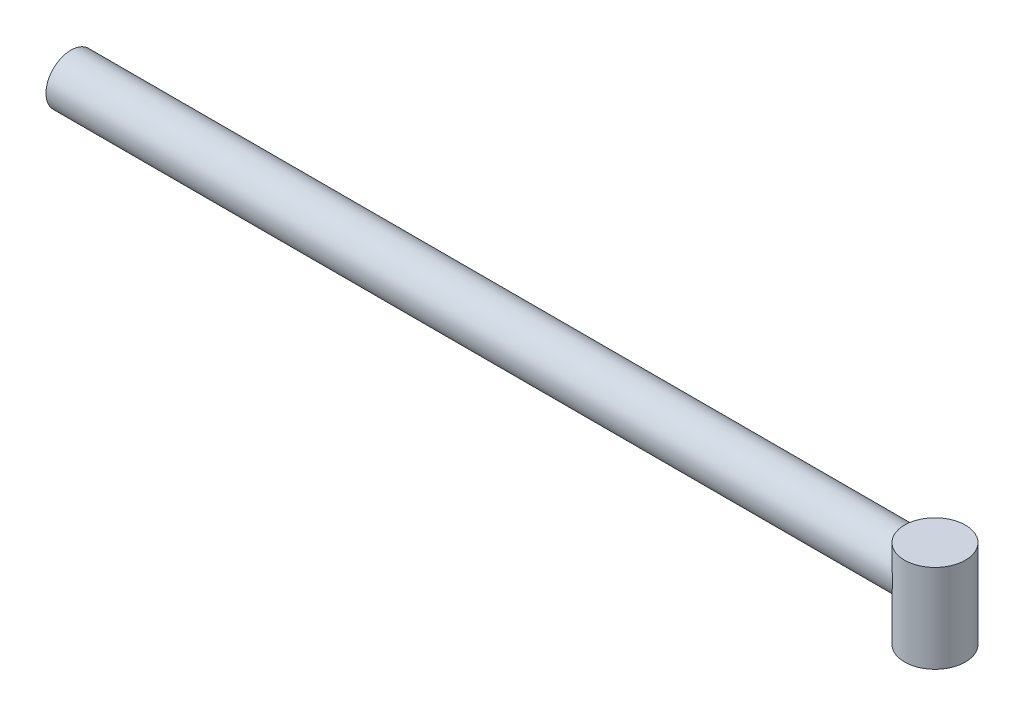
ISO-10303-21;
HEADER;
FILE_DESCRIPTION(('STEP AP214'),'2;1');
FILE_NAME('part.step','',(''),(''),'','','');
FILE_SCHEMA(('AUTOMOTIVE_DESIGN { 1 0 10303 214 1 1 1 1 }'));
ENDSEC;
DATA;
#1=APPLICATION_CONTEXT('core data for automotive mechanical design processes');
#2=APPLICATION_PROTOCOL_DEFINITION('international standard','automotive_design',2000,#1);
#3=PRODUCT_CONTEXT('',#1,'mechanical');
#4=PRODUCT('Part','Part','',(#3));
#5=PRODUCT_RELATED_PRODUCT_CATEGORY('part','',(#4));
#6=PRODUCT_DEFINITION_FORMATION('','',#4);
#7=PRODUCT_DEFINITION_CONTEXT('part definition',#1,'design');
#8=PRODUCT_DEFINITION('design','',#6,#7);
#9=PRODUCT_DEFINITION_SHAPE('','',#8);
#10=(LENGTH_UNIT() NAMED_UNIT(*) SI_UNIT(.MILLI.,.METRE.));
#11=(NAMED_UNIT(*) PLANE_ANGLE_UNIT() SI_UNIT($,.RADIAN.));
#12=(NAMED_UNIT(*) SI_UNIT($,.STERADIAN.) SOLID_ANGLE_UNIT());
#13=UNCERTAINTY_MEASURE_WITH_UNIT(LENGTH_MEASURE(1.E-05),#10,'distance_accuracy_value','');
#14=(GEOMETRIC_REPRESENTATION_CONTEXT(3) GLOBAL_UNCERTAINTY_ASSIGNED_CONTEXT((#13)) GLOBAL_UNIT_ASSIGNED_CONTEXT((#10,
#11,#12)) REPRESENTATION_CONTEXT('',''));
#15=CARTESIAN_POINT('',(0.,0.,0.));
#16=DIRECTION('',(0.,0.,1.));
#17=DIRECTION('',(1.,0.,0.));
#18=AXIS2_PLACEMENT_3D('',#15,#16,#17);
#19=CARTESIAN_POINT('',(-6.39999999999964,51.,-65.));
#20=DIRECTION('',(0.,-1.,0.));
#21=DIRECTION('',(0.,0.,-1.));
#22=AXIS2_PLACEMENT_3D('',#19,#20,#21);
#23=CYLINDRICAL_SURFACE('',#22,5.);
#24=CARTESIAN_POINT('',(-9.26181760425045,46.,-69.1));
#25=CARTESIAN_POINT('',(-9.26182009058065,46.0743333675964,-69.0999989941029));
#26=CARTESIAN_POINT('',(-9.26473134214739,46.148691400117,-69.0979716136917));
#27=CARTESIAN_POINT('',(-9.27621236259499,46.2967686263314,-69.0899197745307));
#28=CARTESIAN_POINT('',(-9.28478581734544,46.3704873721846,-69.0838927121342));
#29=CARTESIAN_POINT('',(-9.31845889761688,46.5901428345058,-69.0599750294437));
#30=CARTESIAN_POINT('',(-9.35150863151791,46.7342780920454,-69.0362487680238));
#31=CARTESIAN_POINT('',(-9.44859245880405,47.0667940029038,-68.963693511387));
#32=CARTESIAN_POINT('',(-9.51957723076212,47.2517070810486,-68.9088119030582));
#33=CARTESIAN_POINT('',(-9.67790203077611,47.6062190125497,-68.777036079782));
#34=CARTESIAN_POINT('',(-9.76529210878694,47.7757685829124,-68.7000741111909));
#35=CARTESIAN_POINT('',(-9.92027668207235,48.0521180884671,-68.55184086964));
#36=CARTESIAN_POINT('',(-9.98610586019386,48.1626742408293,-68.4855883223991));
#37=CARTESIAN_POINT('',(-10.1190471211521,48.376627477181,-68.3433749903128));
#38=CARTESIAN_POINT('',(-10.186159707292,48.4800216758837,-68.2674103274834));
#39=CARTESIAN_POINT('',(-10.3196580517801,48.6793995487549,-68.1060010562011));
#40=CARTESIAN_POINT('',(-10.3860445367348,48.7753913525074,-68.0205671061354));
#41=CARTESIAN_POINT('',(-10.5165124481894,48.9597136762682,-67.8401982287786));
#42=CARTESIAN_POINT('',(-10.5805935986791,49.0480432806814,-67.7452621689434));
#43=CARTESIAN_POINT('',(-10.7413661834399,49.2658249973713,-67.4874158241952));
#44=CARTESIAN_POINT('',(-10.8351631376861,49.3890444882589,-67.3172721814355));
#45=CARTESIAN_POINT('',(-11.0066242670531,49.6105211815253,-66.9542709655562));
#46=CARTESIAN_POINT('',(-11.0843141180581,49.7088181688186,-66.7614503224341));
#47=CARTESIAN_POINT('',(-11.2061326428141,49.8614299133952,-66.3901696160911));
#48=CARTESIAN_POINT('',(-11.2537094028949,49.9203630648498,-66.2147563153638));
#49=CARTESIAN_POINT('',(-11.3300267483656,50.0144647890552,-65.8536989069454));
#50=CARTESIAN_POINT('',(-11.3587779323515,50.0496467338257,-65.6680606197462));
#51=CARTESIAN_POINT('',(-11.395138477444,50.0940902410225,-65.2908702750752));
#52=CARTESIAN_POINT('',(-11.4026656304569,50.1032510153657,-65.0992981202672));
#53=CARTESIAN_POINT('',(-11.395649988203,50.0946947767343,-64.7171677137377));
#54=CARTESIAN_POINT('',(-11.3811073702065,50.0769779796476,-64.5266094538848));
#55=CARTESIAN_POINT('',(-11.3328252513853,50.0178390193171,-64.1641661834551));
#56=CARTESIAN_POINT('',(-11.3003305045733,49.9779530214034,-63.9918556184839));
#57=CARTESIAN_POINT('',(-11.2194064105117,49.8778273788801,-63.6572478892048));
#58=CARTESIAN_POINT('',(-11.1709728725957,49.8175823813199,-63.4949533716817));
#59=CARTESIAN_POINT('',(-11.0561087990059,49.6730707567149,-63.1688276939551));
#60=CARTESIAN_POINT('',(-10.988447623669,49.5871255914144,-63.0061824674516));
#61=CARTESIAN_POINT('',(-10.8416036833038,49.3972732093479,-62.6975198901236));
#62=CARTESIAN_POINT('',(-10.762415713212,49.2933578739271,-62.5515101046173));
#63=CARTESIAN_POINT('',(-10.579164166907,49.0468978648977,-62.2482477434636));
#64=CARTESIAN_POINT('',(-10.4733479577256,48.9008115373582,-62.0949459449713));
#65=CARTESIAN_POINT('',(-10.2571889999979,48.5885797630971,-61.8135367218202));
#66=CARTESIAN_POINT('',(-10.1468397128752,48.4224046176698,-61.6854673535323));
#67=CARTESIAN_POINT('',(-9.9859142468366,48.1617544499398,-61.514730368851));
#68=CARTESIAN_POINT('',(-9.93388940712684,48.0745514583477,-61.4621060134616));
#69=CARTESIAN_POINT('',(-9.83184388980893,47.8955165975834,-61.3630379158359));
#70=CARTESIAN_POINT('',(-9.78182359595807,47.8036838496012,-61.3165953531503));
#71=CARTESIAN_POINT('',(-9.68528598708616,47.6154315657492,-61.2302409013271));
#72=CARTESIAN_POINT('',(-9.6387628974303,47.5190200401088,-61.1903181128449));
#73=CARTESIAN_POINT('',(-9.55091487692975,47.3213993049725,-61.1173468745875));
#74=CARTESIAN_POINT('',(-9.50958695084022,47.2201929067133,-61.0842944564841));
#75=CARTESIAN_POINT('',(-9.42333214516696,46.9828663674868,-61.0171301102789));
#76=CARTESIAN_POINT('',(-9.38082535820453,46.845118834892,-60.9854800611594));
#77=CARTESIAN_POINT('',(-9.31349799464836,46.5630886941962,-60.9363424237359));
#78=CARTESIAN_POINT('',(-9.28863312317822,46.418823427401,-60.9188193505785));
#79=CARTESIAN_POINT('',(-9.26085471811797,46.125795720678,-60.8992865905289));
#80=CARTESIAN_POINT('',(-9.25812359035634,45.9770060346221,-60.8974058096129));
#81=CARTESIAN_POINT('',(-9.27569501176737,45.6814153106385,-60.9097116597854));
#82=CARTESIAN_POINT('',(-9.29602345014249,45.5346166955152,-60.9239163501604));
#83=CARTESIAN_POINT('',(-9.36174048556425,45.2186969036097,-60.9713544760774));
#84=CARTESIAN_POINT('',(-9.41132589739005,45.0509786912207,-61.0078238336239));
#85=CARTESIAN_POINT('',(-9.52848725230185,44.727016163466,-61.0989705982693));
#86=CARTESIAN_POINT('',(-9.5961200433921,44.5708101301447,-61.1537056800922));
#87=CARTESIAN_POINT('',(-9.72467501698522,44.304813789828,-61.264757743731));
#88=CARTESIAN_POINT('',(-9.78355716252405,44.1926171146152,-61.3178091500699));
#89=CARTESIAN_POINT('',(-9.90473029030125,43.9748244670871,-61.4329497873198));
#90=CARTESIAN_POINT('',(-9.96702296119446,43.8692318210825,-61.495043521083));
#91=CARTESIAN_POINT('',(-10.0930118361086,43.6644380029358,-61.6280462153747));
#92=CARTESIAN_POINT('',(-10.1567096145226,43.5652445459816,-61.6989655256377));
#93=CARTESIAN_POINT('',(-10.28376872603,43.3734404793592,-61.8494384912767));
#94=CARTESIAN_POINT('',(-10.3471301181265,43.280828677408,-61.9289905761723));
#95=CARTESIAN_POINT('',(-10.4737979175901,43.099981930436,-62.0990146367421));
#96=CARTESIAN_POINT('',(-10.5370548692623,43.0119374577158,-62.1897267972458));
#97=CARTESIAN_POINT('',(-10.6602349009175,42.8435954797962,-62.3802156967417));
#98=CARTESIAN_POINT('',(-10.7201574197347,42.7632992769263,-62.4799939541107));
#99=CARTESIAN_POINT('',(-10.8350620686006,42.6114559512632,-62.6882225342914));
#100=CARTESIAN_POINT('',(-10.8900565005946,42.5398868720117,-62.7966499090286));
#101=CARTESIAN_POINT('',(-10.9937742658961,42.406321140765,-63.0219605397425));
#102=CARTESIAN_POINT('',(-11.0425008692288,42.3443194938912,-63.1388393363491));
#103=CARTESIAN_POINT('',(-11.1491427651305,42.2096649131438,-63.4261484338255));
#104=CARTESIAN_POINT('',(-11.2036297758161,42.1417653765368,-63.6001971752005));
#105=CARTESIAN_POINT('',(-11.2715386811135,42.0576462750671,-63.8700577329481));
#106=CARTESIAN_POINT('',(-11.2918739652984,42.0325584856985,-63.9614942817499));
#107=CARTESIAN_POINT('',(-11.3275672177725,41.98863050355,-64.1467935648612));
#108=CARTESIAN_POINT('',(-11.3429274860526,41.9697874236958,-64.24065515632));
#109=CARTESIAN_POINT('',(-11.3684146759069,41.9385685252692,-64.4307000918484));
#110=CARTESIAN_POINT('',(-11.3785117453205,41.9262295930058,-64.5268935091968));
#111=CARTESIAN_POINT('',(-11.3931119745868,41.9083996492532,-64.7202981549325));
#112=CARTESIAN_POINT('',(-11.3976174117699,41.9029058499108,-64.8175089526886));
#113=CARTESIAN_POINT('',(-11.4009323516501,41.8988627937779,-65.0121894691503));
#114=CARTESIAN_POINT('',(-11.3997411951592,41.9003143406764,-65.1096592165163));
#115=CARTESIAN_POINT('',(-11.3917000115845,41.9101253910263,-65.3039862963143));
#116=CARTESIAN_POINT('',(-11.3848502518465,41.9184845681205,-65.4008436574611));
#117=CARTESIAN_POINT('',(-11.3575210049604,41.9518909255544,-65.6742262259629));
#118=CARTESIAN_POINT('',(-11.3304223284994,41.9850620416977,-65.8491955121307));
#119=CARTESIAN_POINT('',(-11.259448235178,42.072547534032,-66.1900284521814));
#120=CARTESIAN_POINT('',(-11.2155703941788,42.1268649653181,-66.3558907863927));
#121=CARTESIAN_POINT('',(-11.1104994730877,42.2582802203301,-66.6861666462485));
#122=CARTESIAN_POINT('',(-11.0483594527932,42.3366385314281,-66.8497716003064));
#123=CARTESIAN_POINT('',(-10.9118631377827,42.5114611671474,-67.1615027801489));
#124=CARTESIAN_POINT('',(-10.8374975788245,42.6079392304732,-67.309617127146));
#125=CARTESIAN_POINT('',(-10.7014345938669,42.7883285142576,-67.551752192167));
#126=CARTESIAN_POINT('',(-10.6417026364665,42.8686504344483,-67.6496138475508));
#127=CARTESIAN_POINT('',(-10.5190918815782,43.0368532801185,-67.8364699129736));
#128=CARTESIAN_POINT('',(-10.4562130584492,43.1247342671946,-67.9254642507425));
#129=CARTESIAN_POINT('',(-10.3286181927178,43.3077231740985,-68.0947076693892));
#130=CARTESIAN_POINT('',(-10.2638985721133,43.4028458704489,-68.1749380093583));
#131=CARTESIAN_POINT('',(-10.1343113582493,43.5998754565148,-68.3263853840146));
#132=CARTESIAN_POINT('',(-10.0694438135464,43.7017803633844,-68.3976050355541));
#133=CARTESIAN_POINT('',(-9.95433503486701,43.8910355362051,-68.5174052631807));
#134=CARTESIAN_POINT('',(-9.90379239860504,43.9771533444823,-68.5676495609107));
#135=CARTESIAN_POINT('',(-9.80485716184975,44.1538107616087,-68.6621886982114));
#136=CARTESIAN_POINT('',(-9.75646478887701,44.2443508362627,-68.7064829091986));
#137=CARTESIAN_POINT('',(-9.66329949366474,44.4297990146957,-68.7887636420653));
#138=CARTESIAN_POINT('',(-9.61851902990501,44.5246973318437,-68.8267634909513));
#139=CARTESIAN_POINT('',(-9.53418757929414,44.7190586218242,-68.8961322575996));
#140=CARTESIAN_POINT('',(-9.49463366686034,44.8185189986616,-68.9275048909105));
#141=CARTESIAN_POINT('',(-9.41049140384562,45.0569647393152,-68.9925769503661));
#142=CARTESIAN_POINT('',(-9.36879869343522,45.1978459635595,-69.0234104612569));
#143=CARTESIAN_POINT('',(-9.32038723496659,45.4138360212522,-69.0585381896262));
#144=CARTESIAN_POINT('',(-9.30661315740782,45.4865165218185,-69.0683882534164));
#145=CARTESIAN_POINT('',(-9.28433689983918,45.6330843761889,-69.0842124015643));
#146=CARTESIAN_POINT('',(-9.2758311151182,45.7069708692136,-69.0901891362906));
#147=CARTESIAN_POINT('',(-9.26739870893984,45.8175293049189,-69.0960998702577));
#148=CARTESIAN_POINT('',(-9.26530904816906,45.8539710924374,-69.0975611272639));
#149=CARTESIAN_POINT('',(-9.26251776673476,45.9269399250828,-69.0995115220369));
#150=CARTESIAN_POINT('',(-9.26181638228049,45.9634669836598,-69.1000004943736));
#151=CARTESIAN_POINT('',(-9.26181760425045,46.,-69.1));
#152=B_SPLINE_CURVE_WITH_KNOTS('',3,(#24,#25,#26,#27,#28,#29,#30,#31,#32,#33,#34,#35,#36,#37,
#38,#39,#40,#41,#42,#43,#44,#45,#46,#47,#48,#49,#50,#51,#52,#53,#54,#55,#56,#57,#58,#59,#60,#61,
#62,#63,#64,#65,#66,#67,#68,#69,#70,#71,#72,#73,#74,#75,#76,#77,#78,#79,#80,#81,#82,#83,#84,#85,
#86,#87,#88,#89,#90,#91,#92,#93,#94,#95,#96,#97,#98,#99,#100,#101,#102,#103,#104,#105,#106,#107,
#108,#109,#110,#111,#112,#113,#114,#115,#116,#117,#118,#119,#120,#121,#122,#123,#124,#125,#126,
#127,#128,#129,#130,#131,#132,#133,#134,#135,#136,#137,#138,#139,#140,#141,#142,#143,#144,#145,
#146,#147,#148,#149,#150,#151),.UNSPECIFIED.,.T.,.F.,(4,2,2,2,2,2,2,2,2,2,2,2,2,2,2,2,2,2,2,2,2,
2,2,2,2,2,2,2,2,2,2,2,2,2,2,2,2,2,2,2,2,2,2,2,2,2,2,2,2,2,2,2,2,2,2,2,2,2,2,2,2,2,2,4),(0.,
0.222956094186124,0.446057467185107,0.89314857532832,1.50642155296292,2.12159686463381,
2.55529754088953,2.98917193500966,3.42256283765764,3.85600545725258,4.54343418586188,
5.22975853200966,5.80054700294441,6.371013849202,6.94368729764397,7.51635614624333,
8.05355646598467,8.59089814075596,9.17678746289109,9.76294217592565,10.4706886186615,
11.1794944707106,11.5223849353633,11.8653407335969,12.2077171974506,12.5498953516333,
12.9911052250327,13.4312033616373,13.8749247290875,14.3191447603769,14.8521542409104,
15.386862899702,15.798463688601,16.2102701497482,16.6225641684809,17.0347833077436,
17.4583415660997,17.8819708925911,18.3045114068051,18.7268305730603,19.3078564439152,
19.5984813357324,19.8889716768531,20.1810921882032,20.4730936871708,20.7651289762513,
21.0571504686521,21.5949415436643,22.1328103444164,22.7059578785208,23.2795417501985,
23.6989988945534,24.1184594572664,24.538800123771,24.9590184348377,25.294126271093,
25.6292694812699,25.9636937647723,26.2979300527338,26.7463389645324,26.9699822196938,
27.1934722824423,27.3030310629662,27.412608482844),.UNSPECIFIED.);
#153=CARTESIAN_POINT('',(-9.26181760425045,46.,-69.1));
#154=VERTEX_POINT('',#153);
#155=EDGE_CURVE('E43',#154,#154,#152,.T.);
#156=ORIENTED_EDGE('',*,*,#155,.T.);
#157=EDGE_LOOP('',(#156));
#158=FACE_BOUND('',#157,.T.);
#159=CARTESIAN_POINT('',(-6.39999999999964,51.,-65.));
#160=DIRECTION('',(0.,1.,0.));
#161=DIRECTION('',(0.,0.,1.));
#162=AXIS2_PLACEMENT_3D('',#159,#160,#161);
#163=CIRCLE('',#162,5.);
#164=CARTESIAN_POINT('',(-6.39999999999964,51.,-60.));
#165=VERTEX_POINT('',#164);
#166=EDGE_CURVE('E10',#165,#165,#163,.T.);
#167=ORIENTED_EDGE('',*,*,#166,.F.);
#168=EDGE_LOOP('',(#167));
#169=FACE_BOUND('',#168,.T.);
#170=CARTESIAN_POINT('',(-6.39999999999964,36.5,-65.));
#171=DIRECTION('',(0.,1.,0.));
#172=DIRECTION('',(0.,0.,1.));
#173=AXIS2_PLACEMENT_3D('',#170,#171,#172);
#174=CIRCLE('',#173,5.);
#175=CARTESIAN_POINT('',(-6.39999999999964,36.5,-60.));
#176=VERTEX_POINT('',#175);
#177=EDGE_CURVE('E51',#176,#176,#174,.T.);
#178=ORIENTED_EDGE('',*,*,#177,.T.);
#179=EDGE_LOOP('',(#178));
#180=FACE_BOUND('',#179,.T.);
#181=ADVANCED_FACE('F39',(#158,#169,#180),#23,.T.);
#182=CARTESIAN_POINT('',(-6.39999999999964,51.,-65.));
#183=DIRECTION('',(0.,1.,0.));
#184=DIRECTION('',(0.,0.,1.));
#185=AXIS2_PLACEMENT_3D('',#182,#183,#184);
#186=PLANE('',#185);
#187=ORIENTED_EDGE('',*,*,#166,.T.);
#188=EDGE_LOOP('',(#187));
#189=FACE_BOUND('',#188,.T.);
#190=ADVANCED_FACE('F77',(#189),#186,.T.);
#191=CARTESIAN_POINT('',(-6.39999999999964,36.5,-65.));
#192=DIRECTION('',(0.,1.,0.));
#193=DIRECTION('',(0.,0.,1.));
#194=AXIS2_PLACEMENT_3D('',#191,#192,#193);
#195=PLANE('',#194);
#196=ORIENTED_EDGE('',*,*,#177,.F.);
#197=EDGE_LOOP('',(#196));
#198=FACE_BOUND('',#197,.T.);
#199=ADVANCED_FACE('F67',(#198),#195,.F.);
#200=CARTESIAN_POINT('',(-148.4,46.,-65.));
#201=DIRECTION('',(1.,0.,0.));
#202=DIRECTION('',(0.,0.,-1.));
#203=AXIS2_PLACEMENT_3D('',#200,#201,#202);
#204=CYLINDRICAL_SURFACE('',#203,4.09999999999999);
#205=CARTESIAN_POINT('',(-148.4,46.,-65.));
#206=DIRECTION('',(1.,0.,0.));
#207=DIRECTION('',(0.,0.,-1.));
#208=AXIS2_PLACEMENT_3D('',#205,#206,#207);
#209=CIRCLE('',#208,4.09999999999999);
#210=CARTESIAN_POINT('',(-148.4,46.,-69.1));
#211=VERTEX_POINT('',#210);
#212=EDGE_CURVE('E60',#211,#211,#209,.T.);
#213=ORIENTED_EDGE('',*,*,#212,.T.);
#214=EDGE_LOOP('',(#213));
#215=FACE_BOUND('',#214,.T.);
#216=ORIENTED_EDGE('',*,*,#155,.F.);
#217=EDGE_LOOP('',(#216));
#218=FACE_BOUND('',#217,.T.);
#219=ADVANCED_FACE('F68',(#215,#218),#204,.T.);
#220=CARTESIAN_POINT('',(-148.4,46.,-65.));
#221=DIRECTION('',(1.,0.,0.));
#222=DIRECTION('',(0.,0.,-1.));
#223=AXIS2_PLACEMENT_3D('',#220,#221,#222);
#224=PLANE('',#223);
#225=ORIENTED_EDGE('',*,*,#212,.F.);
#226=EDGE_LOOP('',(#225));
#227=FACE_BOUND('',#226,.T.);
#228=ADVANCED_FACE('F66',(#227),#224,.F.);
#229=CLOSED_SHELL('',(#181,#190,#199,#219,#228));
#230=MANIFOLD_SOLID_BREP('B2',#229);
#231=ADVANCED_BREP_SHAPE_REPRESENTATION('',(#18,#230),#14);
#232=SHAPE_DEFINITION_REPRESENTATION(#9,#231);
ENDSEC;
END-ISO-10303-21;
